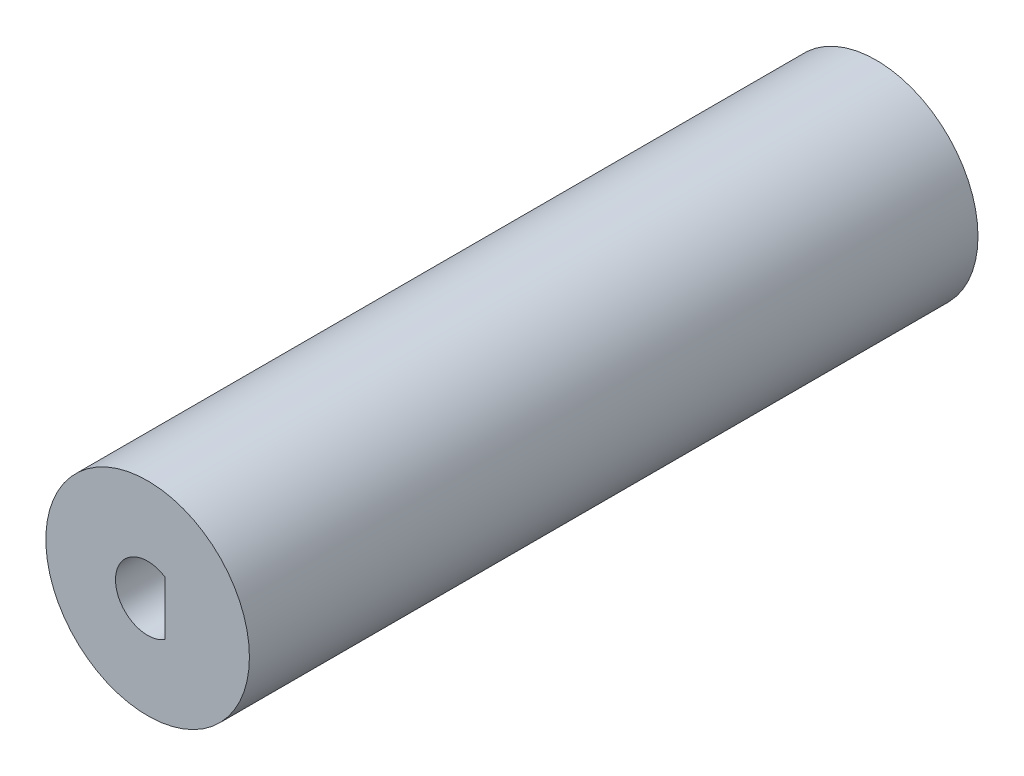
ISO-10303-21;
HEADER;
FILE_DESCRIPTION(('STEP AP214'),'2;1');
FILE_NAME('part.step','',(''),(''),'','','');
FILE_SCHEMA(('AUTOMOTIVE_DESIGN { 1 0 10303 214 1 1 1 1 }'));
ENDSEC;
DATA;
#1=APPLICATION_CONTEXT('core data for automotive mechanical design processes');
#2=APPLICATION_PROTOCOL_DEFINITION('international standard','automotive_design',2000,#1);
#3=PRODUCT_CONTEXT('',#1,'mechanical');
#4=PRODUCT('Part','Part','',(#3));
#5=PRODUCT_RELATED_PRODUCT_CATEGORY('part','',(#4));
#6=PRODUCT_DEFINITION_FORMATION('','',#4);
#7=PRODUCT_DEFINITION_CONTEXT('part definition',#1,'design');
#8=PRODUCT_DEFINITION('design','',#6,#7);
#9=PRODUCT_DEFINITION_SHAPE('','',#8);
#10=(LENGTH_UNIT() NAMED_UNIT(*) SI_UNIT(.MILLI.,.METRE.));
#11=(NAMED_UNIT(*) PLANE_ANGLE_UNIT() SI_UNIT($,.RADIAN.));
#12=(NAMED_UNIT(*) SI_UNIT($,.STERADIAN.) SOLID_ANGLE_UNIT());
#13=UNCERTAINTY_MEASURE_WITH_UNIT(LENGTH_MEASURE(1.E-05),#10,'distance_accuracy_value','');
#14=(GEOMETRIC_REPRESENTATION_CONTEXT(3) GLOBAL_UNCERTAINTY_ASSIGNED_CONTEXT((#13)) GLOBAL_UNIT_ASSIGNED_CONTEXT((#10,
#11,#12)) REPRESENTATION_CONTEXT('',''));
#15=CARTESIAN_POINT('',(0.,0.,0.));
#16=DIRECTION('',(0.,0.,1.));
#17=DIRECTION('',(1.,0.,0.));
#18=AXIS2_PLACEMENT_3D('',#15,#16,#17);
#19=CARTESIAN_POINT('',(0.,0.,0.5));
#20=DIRECTION('',(0.,0.,-1.));
#21=DIRECTION('',(-1.,0.,0.));
#22=AXIS2_PLACEMENT_3D('',#19,#20,#21);
#23=CYLINDRICAL_SURFACE('',#22,4.75);
#24=CARTESIAN_POINT('',(0.,0.,0.5));
#25=DIRECTION('',(0.,0.,1.));
#26=DIRECTION('',(1.,0.,0.));
#27=AXIS2_PLACEMENT_3D('',#24,#25,#26);
#28=CIRCLE('',#27,4.75);
#29=CARTESIAN_POINT('',(4.75,0.,0.5));
#30=VERTEX_POINT('',#29);
#31=EDGE_CURVE('E11',#30,#30,#28,.T.);
#32=ORIENTED_EDGE('',*,*,#31,.F.);
#33=EDGE_LOOP('',(#32));
#34=FACE_BOUND('',#33,.T.);
#35=CARTESIAN_POINT('',(0.,0.,-33.5));
#36=DIRECTION('',(0.,0.,1.));
#37=DIRECTION('',(1.,0.,0.));
#38=AXIS2_PLACEMENT_3D('',#35,#36,#37);
#39=CIRCLE('',#38,4.75);
#40=CARTESIAN_POINT('',(4.75,0.,-33.5));
#41=VERTEX_POINT('',#40);
#42=EDGE_CURVE('E43',#41,#41,#39,.T.);
#43=ORIENTED_EDGE('',*,*,#42,.T.);
#44=EDGE_LOOP('',(#43));
#45=FACE_BOUND('',#44,.T.);
#46=ADVANCED_FACE('F36',(#34,#45),#23,.T.);
#47=CARTESIAN_POINT('',(0.,0.,0.5));
#48=DIRECTION('',(0.,0.,1.));
#49=DIRECTION('',(1.,0.,0.));
#50=AXIS2_PLACEMENT_3D('',#47,#48,#49);
#51=PLANE('',#50);
#52=CARTESIAN_POINT('',(0.,0.,0.5));
#53=DIRECTION('',(0.,0.,1.));
#54=DIRECTION('',(1.,0.,0.));
#55=AXIS2_PLACEMENT_3D('',#52,#53,#54);
#56=CIRCLE('',#55,1.5);
#57=CARTESIAN_POINT('',(0.8,1.26885775404495,0.5));
#58=VERTEX_POINT('',#57);
#59=CARTESIAN_POINT('',(0.8,-1.26885775404495,0.5));
#60=VERTEX_POINT('',#59);
#61=EDGE_CURVE('E50',#58,#60,#56,.T.);
#62=ORIENTED_EDGE('',*,*,#61,.F.);
#63=DIRECTION('',(0.,1.,0.));
#64=VECTOR('',#63,1.);
#65=CARTESIAN_POINT('',(0.8,1.26885775404495,0.5));
#66=LINE('',#65,#64);
#67=EDGE_CURVE('E70',#60,#58,#66,.T.);
#68=ORIENTED_EDGE('',*,*,#67,.F.);
#69=EDGE_LOOP('',(#62,#68));
#70=FACE_BOUND('',#69,.T.);
#71=ORIENTED_EDGE('',*,*,#31,.T.);
#72=EDGE_LOOP('',(#71));
#73=FACE_BOUND('',#72,.T.);
#74=ADVANCED_FACE('F74',(#70,#73),#51,.T.);
#75=CARTESIAN_POINT('',(0.,0.,-33.5));
#76=DIRECTION('',(0.,0.,1.));
#77=DIRECTION('',(1.,0.,0.));
#78=AXIS2_PLACEMENT_3D('',#75,#76,#77);
#79=PLANE('',#78);
#80=CARTESIAN_POINT('',(0.,0.,-33.5));
#81=DIRECTION('',(0.,0.,-1.));
#82=DIRECTION('',(-1.,0.,0.));
#83=AXIS2_PLACEMENT_3D('',#80,#81,#82);
#84=CIRCLE('',#83,1.5);
#85=CARTESIAN_POINT('',(-1.5,0.,-33.5));
#86=VERTEX_POINT('',#85);
#87=EDGE_CURVE('E66',#86,#86,#84,.T.);
#88=ORIENTED_EDGE('',*,*,#87,.F.);
#89=EDGE_LOOP('',(#88));
#90=FACE_BOUND('',#89,.T.);
#91=ORIENTED_EDGE('',*,*,#42,.F.);
#92=EDGE_LOOP('',(#91));
#93=FACE_BOUND('',#92,.T.);
#94=ADVANCED_FACE('F90',(#90,#93),#79,.F.);
#95=CARTESIAN_POINT('',(0.,0.,-23.5));
#96=DIRECTION('',(0.,0.,-1.));
#97=DIRECTION('',(-1.,0.,0.));
#98=AXIS2_PLACEMENT_3D('',#95,#96,#97);
#99=CYLINDRICAL_SURFACE('',#98,1.5);
#100=CARTESIAN_POINT('',(0.,0.,-23.5));
#101=DIRECTION('',(0.,0.,-1.));
#102=DIRECTION('',(-1.,0.,0.));
#103=AXIS2_PLACEMENT_3D('',#100,#101,#102);
#104=CIRCLE('',#103,1.5);
#105=CARTESIAN_POINT('',(-1.5,0.,-23.5));
#106=VERTEX_POINT('',#105);
#107=EDGE_CURVE('E82',#106,#106,#104,.T.);
#108=ORIENTED_EDGE('',*,*,#107,.F.);
#109=EDGE_LOOP('',(#108));
#110=FACE_BOUND('',#109,.T.);
#111=ORIENTED_EDGE('',*,*,#87,.T.);
#112=EDGE_LOOP('',(#111));
#113=FACE_BOUND('',#112,.T.);
#114=ADVANCED_FACE('F92',(#110,#113),#99,.F.);
#115=CARTESIAN_POINT('',(0.,0.,-23.5));
#116=DIRECTION('',(0.,0.,-1.));
#117=DIRECTION('',(-1.,0.,0.));
#118=AXIS2_PLACEMENT_3D('',#115,#116,#117);
#119=PLANE('',#118);
#120=ORIENTED_EDGE('',*,*,#107,.T.);
#121=EDGE_LOOP('',(#120));
#122=FACE_BOUND('',#121,.T.);
#123=ADVANCED_FACE('F99',(#122),#119,.T.);
#124=CARTESIAN_POINT('',(0.,0.,-7.5));
#125=DIRECTION('',(0.,0.,1.));
#126=DIRECTION('',(1.,0.,0.));
#127=AXIS2_PLACEMENT_3D('',#124,#125,#126);
#128=CYLINDRICAL_SURFACE('',#127,1.5);
#129=ORIENTED_EDGE('',*,*,#61,.T.);
#130=DIRECTION('',(0.,0.,1.));
#131=VECTOR('',#130,1.);
#132=CARTESIAN_POINT('',(0.8,-1.26885775404495,-7.5));
#133=LINE('',#132,#131);
#134=CARTESIAN_POINT('',(0.8,-1.26885775404495,-7.5));
#135=VERTEX_POINT('',#134);
#136=EDGE_CURVE('E67',#135,#60,#133,.T.);
#137=ORIENTED_EDGE('',*,*,#136,.F.);
#138=CARTESIAN_POINT('',(0.,0.,-7.5));
#139=DIRECTION('',(0.,0.,1.));
#140=DIRECTION('',(1.,0.,0.));
#141=AXIS2_PLACEMENT_3D('',#138,#139,#140);
#142=CIRCLE('',#141,1.5);
#143=CARTESIAN_POINT('',(0.8,1.26885775404495,-7.5));
#144=VERTEX_POINT('',#143);
#145=EDGE_CURVE('E64',#144,#135,#142,.T.);
#146=ORIENTED_EDGE('',*,*,#145,.F.);
#147=DIRECTION('',(0.,0.,1.));
#148=VECTOR('',#147,1.);
#149=CARTESIAN_POINT('',(0.8,1.26885775404495,-7.5));
#150=LINE('',#149,#148);
#151=EDGE_CURVE('E58',#144,#58,#150,.T.);
#152=ORIENTED_EDGE('',*,*,#151,.T.);
#153=EDGE_LOOP('',(#129,#137,#146,#152));
#154=FACE_BOUND('',#153,.T.);
#155=ADVANCED_FACE('F62',(#154),#128,.F.);
#156=CARTESIAN_POINT('',(0.8,1.26885775404495,-7.5));
#157=DIRECTION('',(1.,0.,0.));
#158=DIRECTION('',(0.,1.,0.));
#159=AXIS2_PLACEMENT_3D('',#156,#157,#158);
#160=PLANE('',#159);
#161=ORIENTED_EDGE('',*,*,#67,.T.);
#162=ORIENTED_EDGE('',*,*,#151,.F.);
#163=DIRECTION('',(0.,1.,0.));
#164=VECTOR('',#163,1.);
#165=CARTESIAN_POINT('',(0.8,1.26885775404495,-7.5));
#166=LINE('',#165,#164);
#167=EDGE_CURVE('E78',#135,#144,#166,.T.);
#168=ORIENTED_EDGE('',*,*,#167,.F.);
#169=ORIENTED_EDGE('',*,*,#136,.T.);
#170=EDGE_LOOP('',(#161,#162,#168,#169));
#171=FACE_BOUND('',#170,.T.);
#172=ADVANCED_FACE('F71',(#171),#160,.F.);
#173=CARTESIAN_POINT('',(0.,0.,-7.5));
#174=DIRECTION('',(0.,0.,1.));
#175=DIRECTION('',(1.,0.,0.));
#176=AXIS2_PLACEMENT_3D('',#173,#174,#175);
#177=PLANE('',#176);
#178=ORIENTED_EDGE('',*,*,#145,.T.);
#179=ORIENTED_EDGE('',*,*,#167,.T.);
#180=EDGE_LOOP('',(#178,#179));
#181=FACE_BOUND('',#180,.T.);
#182=ADVANCED_FACE('F135',(#181),#177,.T.);
#183=CLOSED_SHELL('',(#46,#74,#94,#114,#123,#155,#172,#182));
#184=MANIFOLD_SOLID_BREP('B2',#183);
#185=ADVANCED_BREP_SHAPE_REPRESENTATION('',(#18,#184),#14);
#186=SHAPE_DEFINITION_REPRESENTATION(#9,#185);
ENDSEC;
END-ISO-10303-21;
